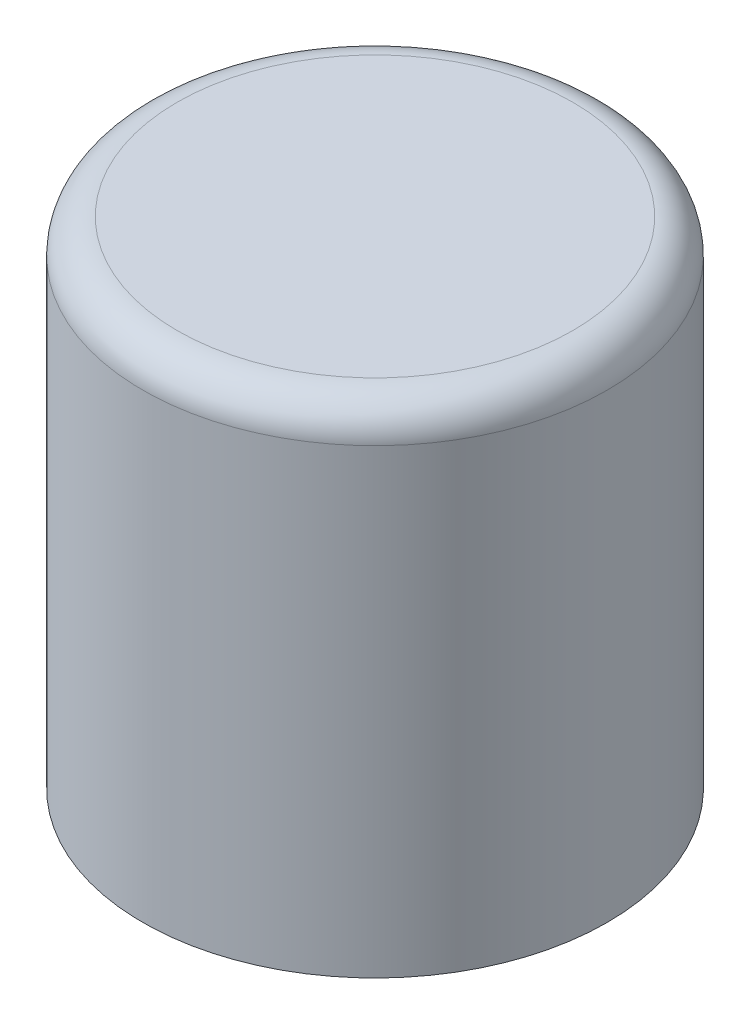
ISO-10303-21;
HEADER;
FILE_DESCRIPTION(('STEP AP214'),'2;1');
FILE_NAME('part.step','',(''),(''),'','','');
FILE_SCHEMA(('AUTOMOTIVE_DESIGN { 1 0 10303 214 1 1 1 1 }'));
ENDSEC;
DATA;
#1=APPLICATION_CONTEXT('core data for automotive mechanical design processes');
#2=APPLICATION_PROTOCOL_DEFINITION('international standard','automotive_design',2000,#1);
#3=PRODUCT_CONTEXT('',#1,'mechanical');
#4=PRODUCT('Part','Part','',(#3));
#5=PRODUCT_RELATED_PRODUCT_CATEGORY('part','',(#4));
#6=PRODUCT_DEFINITION_FORMATION('','',#4);
#7=PRODUCT_DEFINITION_CONTEXT('part definition',#1,'design');
#8=PRODUCT_DEFINITION('design','',#6,#7);
#9=PRODUCT_DEFINITION_SHAPE('','',#8);
#10=(LENGTH_UNIT() NAMED_UNIT(*) SI_UNIT(.MILLI.,.METRE.));
#11=(NAMED_UNIT(*) PLANE_ANGLE_UNIT() SI_UNIT($,.RADIAN.));
#12=(NAMED_UNIT(*) SI_UNIT($,.STERADIAN.) SOLID_ANGLE_UNIT());
#13=UNCERTAINTY_MEASURE_WITH_UNIT(LENGTH_MEASURE(1.E-05),#10,'distance_accuracy_value','');
#14=(GEOMETRIC_REPRESENTATION_CONTEXT(3) GLOBAL_UNCERTAINTY_ASSIGNED_CONTEXT((#13)) GLOBAL_UNIT_ASSIGNED_CONTEXT((#10,
#11,#12)) REPRESENTATION_CONTEXT('',''));
#15=CARTESIAN_POINT('',(0.,0.,0.));
#16=DIRECTION('',(0.,0.,1.));
#17=DIRECTION('',(1.,0.,0.));
#18=AXIS2_PLACEMENT_3D('',#15,#16,#17);
#19=CARTESIAN_POINT('',(-13.5,28.8,0.));
#20=DIRECTION('',(0.,-1.,0.));
#21=DIRECTION('',(1.,0.,0.));
#22=AXIS2_PLACEMENT_3D('',#19,#20,#21);
#23=PLANE('',#22);
#24=CARTESIAN_POINT('',(0.,28.8,0.));
#25=DIRECTION('',(0.,-1.,0.));
#26=DIRECTION('',(1.,0.,0.));
#27=AXIS2_PLACEMENT_3D('',#24,#25,#26);
#28=CIRCLE('',#27,11.5);
#29=CARTESIAN_POINT('',(11.5,28.8,0.));
#30=VERTEX_POINT('',#29);
#31=EDGE_CURVE('E10',#30,#30,#28,.F.);
#32=ORIENTED_EDGE('',*,*,#31,.T.);
#33=EDGE_LOOP('',(#32));
#34=FACE_BOUND('',#33,.T.);
#35=ADVANCED_FACE('F37',(#34),#23,.F.);
#36=CARTESIAN_POINT('',(0.,0.,0.));
#37=DIRECTION('',(0.,-1.,0.));
#38=DIRECTION('',(1.,0.,0.));
#39=AXIS2_PLACEMENT_3D('',#36,#37,#38);
#40=CYLINDRICAL_SURFACE('',#39,13.5);
#41=CARTESIAN_POINT('',(0.,26.8,0.));
#42=DIRECTION('',(0.,-1.,0.));
#43=DIRECTION('',(1.,0.,0.));
#44=AXIS2_PLACEMENT_3D('',#41,#42,#43);
#45=CIRCLE('',#44,13.5);
#46=CARTESIAN_POINT('',(13.5,26.8,0.));
#47=VERTEX_POINT('',#46);
#48=EDGE_CURVE('E44',#47,#47,#45,.T.);
#49=ORIENTED_EDGE('',*,*,#48,.T.);
#50=EDGE_LOOP('',(#49));
#51=FACE_BOUND('',#50,.T.);
#52=CARTESIAN_POINT('',(0.,0.,0.));
#53=DIRECTION('',(0.,-1.,0.));
#54=DIRECTION('',(1.,0.,0.));
#55=AXIS2_PLACEMENT_3D('',#52,#53,#54);
#56=CIRCLE('',#55,13.5);
#57=CARTESIAN_POINT('',(13.5,0.,0.));
#58=VERTEX_POINT('',#57);
#59=EDGE_CURVE('E48',#58,#58,#56,.T.);
#60=ORIENTED_EDGE('',*,*,#59,.F.);
#61=EDGE_LOOP('',(#60));
#62=FACE_BOUND('',#61,.T.);
#63=ADVANCED_FACE('F108',(#51,#62),#40,.T.);
#64=CARTESIAN_POINT('',(-12.,0.,0.));
#65=DIRECTION('',(0.,1.,0.));
#66=DIRECTION('',(-1.,0.,0.));
#67=AXIS2_PLACEMENT_3D('',#64,#65,#66);
#68=PLANE('',#67);
#69=CARTESIAN_POINT('',(0.,0.,0.));
#70=DIRECTION('',(0.,-1.,0.));
#71=DIRECTION('',(1.,0.,0.));
#72=AXIS2_PLACEMENT_3D('',#69,#70,#71);
#73=CIRCLE('',#72,12.);
#74=CARTESIAN_POINT('',(12.,0.,0.));
#75=VERTEX_POINT('',#74);
#76=EDGE_CURVE('E52',#75,#75,#73,.T.);
#77=ORIENTED_EDGE('',*,*,#76,.F.);
#78=EDGE_LOOP('',(#77));
#79=FACE_BOUND('',#78,.T.);
#80=ORIENTED_EDGE('',*,*,#59,.T.);
#81=EDGE_LOOP('',(#80));
#82=FACE_BOUND('',#81,.T.);
#83=ADVANCED_FACE('F102',(#79,#82),#68,.F.);
#84=CARTESIAN_POINT('',(0.,0.,0.));
#85=DIRECTION('',(0.,-1.,0.));
#86=DIRECTION('',(1.,0.,0.));
#87=AXIS2_PLACEMENT_3D('',#84,#85,#86);
#88=CYLINDRICAL_SURFACE('',#87,12.);
#89=CARTESIAN_POINT('',(0.,2.,0.));
#90=DIRECTION('',(0.,-1.,0.));
#91=DIRECTION('',(1.,0.,0.));
#92=AXIS2_PLACEMENT_3D('',#89,#90,#91);
#93=CIRCLE('',#92,12.);
#94=CARTESIAN_POINT('',(12.,2.,0.));
#95=VERTEX_POINT('',#94);
#96=EDGE_CURVE('E57',#95,#95,#93,.T.);
#97=ORIENTED_EDGE('',*,*,#96,.F.);
#98=EDGE_LOOP('',(#97));
#99=FACE_BOUND('',#98,.T.);
#100=ORIENTED_EDGE('',*,*,#76,.T.);
#101=EDGE_LOOP('',(#100));
#102=FACE_BOUND('',#101,.T.);
#103=ADVANCED_FACE('F96',(#99,#102),#88,.F.);
#104=CARTESIAN_POINT('',(-12.5,2.,0.));
#105=DIRECTION('',(0.,-1.,0.));
#106=DIRECTION('',(1.,0.,0.));
#107=AXIS2_PLACEMENT_3D('',#104,#105,#106);
#108=PLANE('',#107);
#109=CARTESIAN_POINT('',(0.,2.,0.));
#110=DIRECTION('',(0.,-1.,0.));
#111=DIRECTION('',(1.,0.,0.));
#112=AXIS2_PLACEMENT_3D('',#109,#110,#111);
#113=CIRCLE('',#112,12.5);
#114=CARTESIAN_POINT('',(12.5,2.,0.));
#115=VERTEX_POINT('',#114);
#116=EDGE_CURVE('E60',#115,#115,#113,.T.);
#117=ORIENTED_EDGE('',*,*,#116,.F.);
#118=EDGE_LOOP('',(#117));
#119=FACE_BOUND('',#118,.T.);
#120=ORIENTED_EDGE('',*,*,#96,.T.);
#121=EDGE_LOOP('',(#120));
#122=FACE_BOUND('',#121,.T.);
#123=ADVANCED_FACE('F90',(#119,#122),#108,.F.);
#124=CARTESIAN_POINT('',(0.,0.,0.));
#125=DIRECTION('',(0.,-1.,0.));
#126=DIRECTION('',(1.,0.,0.));
#127=AXIS2_PLACEMENT_3D('',#124,#125,#126);
#128=CYLINDRICAL_SURFACE('',#127,12.5);
#129=CARTESIAN_POINT('',(0.,3.,0.));
#130=DIRECTION('',(0.,-1.,0.));
#131=DIRECTION('',(1.,0.,0.));
#132=AXIS2_PLACEMENT_3D('',#129,#130,#131);
#133=CIRCLE('',#132,12.5);
#134=CARTESIAN_POINT('',(12.5,3.,0.));
#135=VERTEX_POINT('',#134);
#136=EDGE_CURVE('E63',#135,#135,#133,.T.);
#137=ORIENTED_EDGE('',*,*,#136,.F.);
#138=EDGE_LOOP('',(#137));
#139=FACE_BOUND('',#138,.T.);
#140=ORIENTED_EDGE('',*,*,#116,.T.);
#141=EDGE_LOOP('',(#140));
#142=FACE_BOUND('',#141,.T.);
#143=ADVANCED_FACE('F84',(#139,#142),#128,.F.);
#144=CARTESIAN_POINT('',(-12.5,3.,0.));
#145=DIRECTION('',(0.,1.,0.));
#146=DIRECTION('',(-1.,0.,0.));
#147=AXIS2_PLACEMENT_3D('',#144,#145,#146);
#148=PLANE('',#147);
#149=CARTESIAN_POINT('',(0.,3.,0.));
#150=DIRECTION('',(0.,-1.,0.));
#151=DIRECTION('',(1.,0.,0.));
#152=AXIS2_PLACEMENT_3D('',#149,#150,#151);
#153=CIRCLE('',#152,12.);
#154=CARTESIAN_POINT('',(12.,3.,0.));
#155=VERTEX_POINT('',#154);
#156=EDGE_CURVE('E66',#155,#155,#153,.T.);
#157=ORIENTED_EDGE('',*,*,#156,.F.);
#158=EDGE_LOOP('',(#157));
#159=FACE_BOUND('',#158,.T.);
#160=ORIENTED_EDGE('',*,*,#136,.T.);
#161=EDGE_LOOP('',(#160));
#162=FACE_BOUND('',#161,.T.);
#163=ADVANCED_FACE('F78',(#159,#162),#148,.F.);
#164=CARTESIAN_POINT('',(0.,0.,0.));
#165=DIRECTION('',(0.,-1.,0.));
#166=DIRECTION('',(1.,0.,0.));
#167=AXIS2_PLACEMENT_3D('',#164,#165,#166);
#168=CYLINDRICAL_SURFACE('',#167,12.);
#169=CARTESIAN_POINT('',(0.,25.8,0.));
#170=DIRECTION('',(0.,-1.,0.));
#171=DIRECTION('',(1.,0.,0.));
#172=AXIS2_PLACEMENT_3D('',#169,#170,#171);
#173=CIRCLE('',#172,12.);
#174=CARTESIAN_POINT('',(12.,25.8,0.));
#175=VERTEX_POINT('',#174);
#176=EDGE_CURVE('E69',#175,#175,#173,.T.);
#177=ORIENTED_EDGE('',*,*,#176,.F.);
#178=EDGE_LOOP('',(#177));
#179=FACE_BOUND('',#178,.T.);
#180=ORIENTED_EDGE('',*,*,#156,.T.);
#181=EDGE_LOOP('',(#180));
#182=FACE_BOUND('',#181,.T.);
#183=ADVANCED_FACE('F75',(#179,#182),#168,.F.);
#184=CARTESIAN_POINT('',(-12.,25.8,0.));
#185=DIRECTION('',(0.,1.,0.));
#186=DIRECTION('',(-1.,0.,0.));
#187=AXIS2_PLACEMENT_3D('',#184,#185,#186);
#188=PLANE('',#187);
#189=ORIENTED_EDGE('',*,*,#176,.T.);
#190=EDGE_LOOP('',(#189));
#191=FACE_BOUND('',#190,.T.);
#192=ADVANCED_FACE('F73',(#191),#188,.F.);
#193=CARTESIAN_POINT('',(0.,26.8,0.));
#194=DIRECTION('',(0.,-1.,0.));
#195=DIRECTION('',(1.,0.,0.));
#196=AXIS2_PLACEMENT_3D('',#193,#194,#195);
#197=TOROIDAL_SURFACE('',#196,11.5,2.);
#198=ORIENTED_EDGE('',*,*,#31,.F.);
#199=EDGE_LOOP('',(#198));
#200=FACE_BOUND('',#199,.T.);
#201=ORIENTED_EDGE('',*,*,#48,.F.);
#202=EDGE_LOOP('',(#201));
#203=FACE_BOUND('',#202,.T.);
#204=ADVANCED_FACE('F39',(#200,#203),#197,.T.);
#205=CLOSED_SHELL('',(#35,#63,#83,#103,#123,#143,#163,#183,#192,#204));
#206=MANIFOLD_SOLID_BREP('B2',#205);
#207=ADVANCED_BREP_SHAPE_REPRESENTATION('',(#18,#206),#14);
#208=SHAPE_DEFINITION_REPRESENTATION(#9,#207);
ENDSEC;
END-ISO-10303-21;
